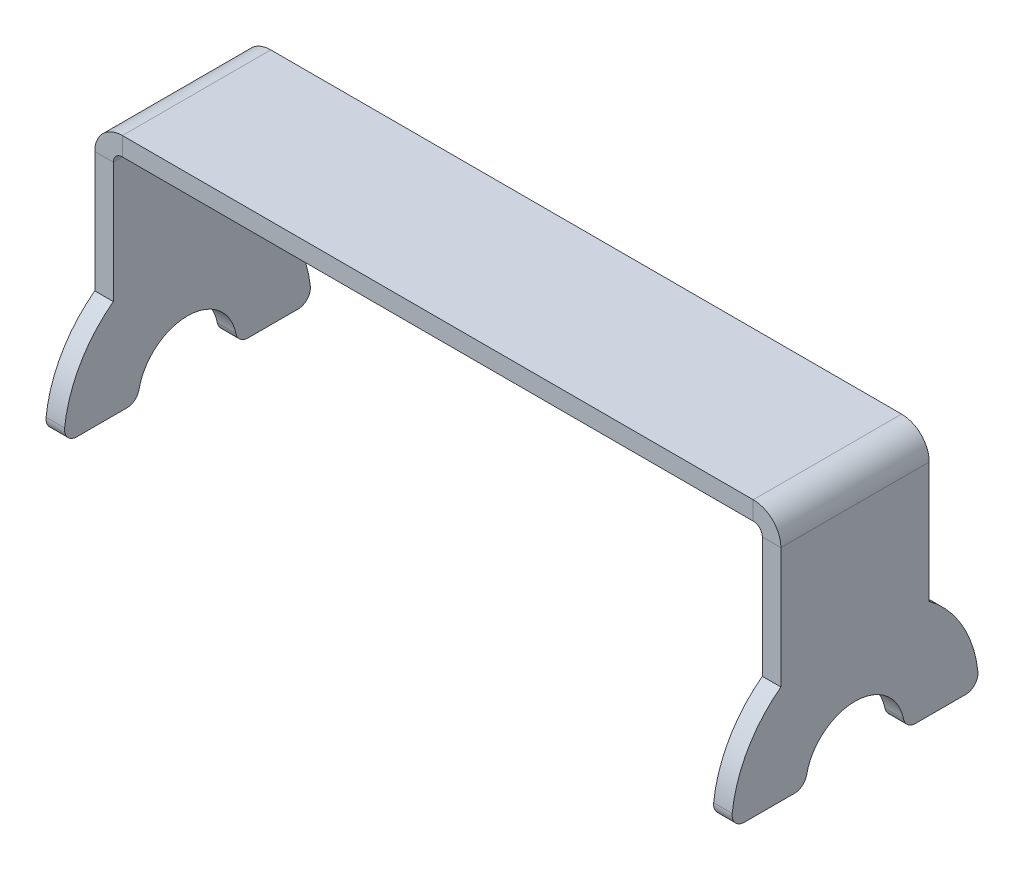
ISO-10303-21;
HEADER;
FILE_DESCRIPTION(('STEP AP214'),'2;1');
FILE_NAME('part.step','',(''),(''),'','','');
FILE_SCHEMA(('AUTOMOTIVE_DESIGN { 1 0 10303 214 1 1 1 1 }'));
ENDSEC;
DATA;
#1=APPLICATION_CONTEXT('core data for automotive mechanical design processes');
#2=APPLICATION_PROTOCOL_DEFINITION('international standard','automotive_design',2000,#1);
#3=PRODUCT_CONTEXT('',#1,'mechanical');
#4=PRODUCT('Part','Part','',(#3));
#5=PRODUCT_RELATED_PRODUCT_CATEGORY('part','',(#4));
#6=PRODUCT_DEFINITION_FORMATION('','',#4);
#7=PRODUCT_DEFINITION_CONTEXT('part definition',#1,'design');
#8=PRODUCT_DEFINITION('design','',#6,#7);
#9=PRODUCT_DEFINITION_SHAPE('','',#8);
#10=(LENGTH_UNIT() NAMED_UNIT(*) SI_UNIT(.MILLI.,.METRE.));
#11=(NAMED_UNIT(*) PLANE_ANGLE_UNIT() SI_UNIT($,.RADIAN.));
#12=(NAMED_UNIT(*) SI_UNIT($,.STERADIAN.) SOLID_ANGLE_UNIT());
#13=UNCERTAINTY_MEASURE_WITH_UNIT(LENGTH_MEASURE(1.E-05),#10,'distance_accuracy_value','');
#14=(GEOMETRIC_REPRESENTATION_CONTEXT(3) GLOBAL_UNCERTAINTY_ASSIGNED_CONTEXT((#13)) GLOBAL_UNIT_ASSIGNED_CONTEXT((#10,
#11,#12)) REPRESENTATION_CONTEXT('',''));
#15=CARTESIAN_POINT('',(0.,0.,0.));
#16=DIRECTION('',(0.,0.,1.));
#17=DIRECTION('',(1.,0.,0.));
#18=AXIS2_PLACEMENT_3D('',#15,#16,#17);
#19=CARTESIAN_POINT('',(-27.7500000000001,-20.,6.));
#20=DIRECTION('',(0.,1.,0.));
#21=DIRECTION('',(-1.,0.,0.));
#22=AXIS2_PLACEMENT_3D('',#19,#20,#21);
#23=PLANE('',#22);
#24=DIRECTION('',(0.,0.,-1.));
#25=VECTOR('',#24,1.);
#26=CARTESIAN_POINT('',(-26.2500000000001,-20.,6.));
#27=LINE('',#26,#25);
#28=CARTESIAN_POINT('',(-26.2500000000001,-20.,-8.94427190999916));
#29=VERTEX_POINT('',#28);
#30=CARTESIAN_POINT('',(-26.2500000000001,-20.,-4.89897948556635));
#31=VERTEX_POINT('',#30);
#32=EDGE_CURVE('E353',#29,#31,#27,.F.);
#33=ORIENTED_EDGE('',*,*,#32,.T.);
#34=DIRECTION('',(-1.,0.,0.));
#35=VECTOR('',#34,1.);
#36=CARTESIAN_POINT('',(-27.7500000000001,-20.,-4.89897948556635));
#37=LINE('',#36,#35);
#38=CARTESIAN_POINT('',(-27.7500000000001,-20.,-4.89897948556635));
#39=VERTEX_POINT('',#38);
#40=EDGE_CURVE('E88',#31,#39,#37,.T.);
#41=ORIENTED_EDGE('',*,*,#40,.T.);
#42=DIRECTION('',(0.,0.,1.));
#43=VECTOR('',#42,1.);
#44=CARTESIAN_POINT('',(-27.7500000000001,-20.,0.));
#45=LINE('',#44,#43);
#46=CARTESIAN_POINT('',(-27.7500000000001,-20.,-8.94427190999916));
#47=VERTEX_POINT('',#46);
#48=EDGE_CURVE('E344',#47,#39,#45,.T.);
#49=ORIENTED_EDGE('',*,*,#48,.F.);
#50=DIRECTION('',(1.,0.,0.));
#51=VECTOR('',#50,1.);
#52=CARTESIAN_POINT('',(-26.25,-20.,-8.94427190999916));
#53=LINE('',#52,#51);
#54=EDGE_CURVE('E460',#47,#29,#53,.T.);
#55=ORIENTED_EDGE('',*,*,#54,.T.);
#56=EDGE_LOOP('',(#33,#41,#49,#55));
#57=FACE_BOUND('',#56,.T.);
#58=ADVANCED_FACE('F80',(#57),#23,.F.);
#59=CARTESIAN_POINT('',(27.7500000000001,-20.,-6.));
#60=DIRECTION('',(0.,1.,0.));
#61=DIRECTION('',(-1.,0.,0.));
#62=AXIS2_PLACEMENT_3D('',#59,#60,#61);
#63=PLANE('',#62);
#64=DIRECTION('',(0.,0.,-1.));
#65=VECTOR('',#64,1.);
#66=CARTESIAN_POINT('',(27.7500000000001,-20.,0.));
#67=LINE('',#66,#65);
#68=CARTESIAN_POINT('',(27.7500000000001,-20.,-4.8989794855663));
#69=VERTEX_POINT('',#68);
#70=CARTESIAN_POINT('',(27.7500000000001,-20.,-8.9442719099993));
#71=VERTEX_POINT('',#70);
#72=EDGE_CURVE('E292',#69,#71,#67,.T.);
#73=ORIENTED_EDGE('',*,*,#72,.F.);
#74=DIRECTION('',(-1.,0.,0.));
#75=VECTOR('',#74,1.);
#76=CARTESIAN_POINT('',(27.7500000000001,-20.,-4.8989794855663));
#77=LINE('',#76,#75);
#78=CARTESIAN_POINT('',(26.2500000000001,-20.,-4.8989794855663));
#79=VERTEX_POINT('',#78);
#80=EDGE_CURVE('E429',#69,#79,#77,.T.);
#81=ORIENTED_EDGE('',*,*,#80,.T.);
#82=DIRECTION('',(0.,0.,1.));
#83=VECTOR('',#82,1.);
#84=CARTESIAN_POINT('',(26.2500000000001,-20.,-6.));
#85=LINE('',#84,#83);
#86=CARTESIAN_POINT('',(26.2500000000001,-20.,-8.9442719099993));
#87=VERTEX_POINT('',#86);
#88=EDGE_CURVE('E302',#79,#87,#85,.F.);
#89=ORIENTED_EDGE('',*,*,#88,.T.);
#90=DIRECTION('',(-1.,0.,0.));
#91=VECTOR('',#90,1.);
#92=CARTESIAN_POINT('',(27.7500000000001,-20.,-8.9442719099993));
#93=LINE('',#92,#91);
#94=EDGE_CURVE('E426',#87,#71,#93,.F.);
#95=ORIENTED_EDGE('',*,*,#94,.T.);
#96=EDGE_LOOP('',(#73,#81,#89,#95));
#97=FACE_BOUND('',#96,.T.);
#98=ADVANCED_FACE('F593',(#97),#63,.F.);
#99=CARTESIAN_POINT('',(0.,-1.5,0.));
#100=DIRECTION('',(0.,-1.,0.));
#101=DIRECTION('',(0.,0.,-1.));
#102=AXIS2_PLACEMENT_3D('',#99,#100,#101);
#103=PLANE('',#102);
#104=DIRECTION('',(-1.,0.,0.));
#105=VECTOR('',#104,1.);
#106=CARTESIAN_POINT('',(-27.75,-1.5,-6.));
#107=LINE('',#106,#105);
#108=CARTESIAN_POINT('',(25.5134,-1.5,-6.));
#109=VERTEX_POINT('',#108);
#110=CARTESIAN_POINT('',(-25.5134,-1.5,-6.));
#111=VERTEX_POINT('',#110);
#112=EDGE_CURVE('E391',#109,#111,#107,.T.);
#113=ORIENTED_EDGE('',*,*,#112,.F.);
#114=DIRECTION('',(0.,0.,1.));
#115=VECTOR('',#114,1.);
#116=CARTESIAN_POINT('',(25.5134,-1.5,6.));
#117=LINE('',#116,#115);
#118=CARTESIAN_POINT('',(25.5134,-1.5,6.));
#119=VERTEX_POINT('',#118);
#120=EDGE_CURVE('E328',#119,#109,#117,.F.);
#121=ORIENTED_EDGE('',*,*,#120,.F.);
#122=DIRECTION('',(1.,0.,0.));
#123=VECTOR('',#122,1.);
#124=CARTESIAN_POINT('',(-27.75,-1.5,6.));
#125=LINE('',#124,#123);
#126=CARTESIAN_POINT('',(-25.5134,-1.5,6.));
#127=VERTEX_POINT('',#126);
#128=EDGE_CURVE('E393',#127,#119,#125,.T.);
#129=ORIENTED_EDGE('',*,*,#128,.F.);
#130=DIRECTION('',(0.,0.,-1.));
#131=VECTOR('',#130,1.);
#132=CARTESIAN_POINT('',(-25.5134,-1.5,-6.));
#133=LINE('',#132,#131);
#134=EDGE_CURVE('E381',#111,#127,#133,.F.);
#135=ORIENTED_EDGE('',*,*,#134,.F.);
#136=EDGE_LOOP('',(#113,#121,#129,#135));
#137=FACE_BOUND('',#136,.T.);
#138=ADVANCED_FACE('F557',(#137),#103,.T.);
#139=CARTESIAN_POINT('',(0.,0.,0.));
#140=DIRECTION('',(0.,-1.,0.));
#141=DIRECTION('',(0.,0.,-1.));
#142=AXIS2_PLACEMENT_3D('',#139,#140,#141);
#143=PLANE('',#142);
#144=DIRECTION('',(0.,0.,1.));
#145=VECTOR('',#144,1.);
#146=CARTESIAN_POINT('',(25.5134,0.,6.));
#147=LINE('',#146,#145);
#148=CARTESIAN_POINT('',(25.5134,0.,6.));
#149=VERTEX_POINT('',#148);
#150=CARTESIAN_POINT('',(25.5134,0.,-6.));
#151=VERTEX_POINT('',#150);
#152=EDGE_CURVE('E316',#149,#151,#147,.F.);
#153=ORIENTED_EDGE('',*,*,#152,.T.);
#154=DIRECTION('',(-1.,0.,0.));
#155=VECTOR('',#154,1.);
#156=CARTESIAN_POINT('',(-27.75,0.,-6.));
#157=LINE('',#156,#155);
#158=CARTESIAN_POINT('',(-25.5134,0.,-6.));
#159=VERTEX_POINT('',#158);
#160=EDGE_CURVE('E389',#151,#159,#157,.T.);
#161=ORIENTED_EDGE('',*,*,#160,.T.);
#162=DIRECTION('',(0.,0.,-1.));
#163=VECTOR('',#162,1.);
#164=CARTESIAN_POINT('',(-25.5134,0.,-6.));
#165=LINE('',#164,#163);
#166=CARTESIAN_POINT('',(-25.5134,0.,6.));
#167=VERTEX_POINT('',#166);
#168=EDGE_CURVE('E369',#159,#167,#165,.F.);
#169=ORIENTED_EDGE('',*,*,#168,.T.);
#170=DIRECTION('',(1.,0.,0.));
#171=VECTOR('',#170,1.);
#172=CARTESIAN_POINT('',(-27.75,0.,6.));
#173=LINE('',#172,#171);
#174=EDGE_CURVE('E394',#167,#149,#173,.T.);
#175=ORIENTED_EDGE('',*,*,#174,.T.);
#176=EDGE_LOOP('',(#153,#161,#169,#175));
#177=FACE_BOUND('',#176,.T.);
#178=ADVANCED_FACE('F580',(#177),#143,.F.);
#179=CARTESIAN_POINT('',(-27.75,-1.5,6.));
#180=DIRECTION('',(0.,0.,1.));
#181=DIRECTION('',(1.,0.,0.));
#182=AXIS2_PLACEMENT_3D('',#179,#180,#181);
#183=PLANE('',#182);
#184=ORIENTED_EDGE('',*,*,#128,.T.);
#185=DIRECTION('',(0.,1.,0.));
#186=VECTOR('',#185,1.);
#187=CARTESIAN_POINT('',(25.5134,-1.5,6.));
#188=LINE('',#187,#186);
#189=EDGE_CURVE('E322',#119,#149,#188,.T.);
#190=ORIENTED_EDGE('',*,*,#189,.T.);
#191=ORIENTED_EDGE('',*,*,#174,.F.);
#192=DIRECTION('',(0.,1.,0.));
#193=VECTOR('',#192,1.);
#194=CARTESIAN_POINT('',(-25.5134,-1.5,6.));
#195=LINE('',#194,#193);
#196=EDGE_CURVE('E386',#127,#167,#195,.T.);
#197=ORIENTED_EDGE('',*,*,#196,.F.);
#198=EDGE_LOOP('',(#184,#190,#191,#197));
#199=FACE_BOUND('',#198,.T.);
#200=ADVANCED_FACE('F552',(#199),#183,.T.);
#201=CARTESIAN_POINT('',(-27.75,-1.5,-6.));
#202=DIRECTION('',(0.,0.,-1.));
#203=DIRECTION('',(-1.,0.,0.));
#204=AXIS2_PLACEMENT_3D('',#201,#202,#203);
#205=PLANE('',#204);
#206=DIRECTION('',(0.,1.,0.));
#207=VECTOR('',#206,1.);
#208=CARTESIAN_POINT('',(25.5134,-1.5,-6.));
#209=LINE('',#208,#207);
#210=EDGE_CURVE('E335',#109,#151,#209,.T.);
#211=ORIENTED_EDGE('',*,*,#210,.F.);
#212=ORIENTED_EDGE('',*,*,#112,.T.);
#213=DIRECTION('',(0.,1.,0.));
#214=VECTOR('',#213,1.);
#215=CARTESIAN_POINT('',(-25.5134,-1.5,-6.));
#216=LINE('',#215,#214);
#217=EDGE_CURVE('E375',#111,#159,#216,.T.);
#218=ORIENTED_EDGE('',*,*,#217,.T.);
#219=ORIENTED_EDGE('',*,*,#160,.F.);
#220=EDGE_LOOP('',(#211,#212,#218,#219));
#221=FACE_BOUND('',#220,.T.);
#222=ADVANCED_FACE('F582',(#221),#205,.T.);
#223=CARTESIAN_POINT('',(-25.5134,-2.2366,6.));
#224=DIRECTION('',(0.,0.,1.));
#225=DIRECTION('',(1.,0.,0.));
#226=AXIS2_PLACEMENT_3D('',#223,#224,#225);
#227=PLANE('',#226);
#228=DIRECTION('',(1.,0.,0.));
#229=VECTOR('',#228,1.);
#230=CARTESIAN_POINT('',(-27.75,-2.23659999999999,6.));
#231=LINE('',#230,#229);
#232=CARTESIAN_POINT('',(-26.25,-2.2366,6.));
#233=VERTEX_POINT('',#232);
#234=CARTESIAN_POINT('',(-27.75,-2.23659999999999,6.));
#235=VERTEX_POINT('',#234);
#236=EDGE_CURVE('E338',#233,#235,#231,.F.);
#237=ORIENTED_EDGE('',*,*,#236,.F.);
#238=CARTESIAN_POINT('',(-25.5134,-2.2366,6.));
#239=DIRECTION('',(0.,0.,-1.));
#240=DIRECTION('',(-1.,0.,0.));
#241=AXIS2_PLACEMENT_3D('',#238,#239,#240);
#242=CIRCLE('',#241,0.7366);
#243=EDGE_CURVE('E378',#127,#233,#242,.F.);
#244=ORIENTED_EDGE('',*,*,#243,.F.);
#245=ORIENTED_EDGE('',*,*,#196,.T.);
#246=CARTESIAN_POINT('',(-25.5134,-2.2366,6.));
#247=DIRECTION('',(0.,0.,-1.));
#248=DIRECTION('',(-1.,0.,0.));
#249=AXIS2_PLACEMENT_3D('',#246,#247,#248);
#250=CIRCLE('',#249,2.2366);
#251=EDGE_CURVE('E371',#167,#235,#250,.F.);
#252=ORIENTED_EDGE('',*,*,#251,.T.);
#253=EDGE_LOOP('',(#237,#244,#245,#252));
#254=FACE_BOUND('',#253,.T.);
#255=ADVANCED_FACE('F548',(#254),#227,.T.);
#256=CARTESIAN_POINT('',(-25.5134,-2.2366,-6.));
#257=DIRECTION('',(0.,0.,1.));
#258=DIRECTION('',(1.,0.,0.));
#259=AXIS2_PLACEMENT_3D('',#256,#257,#258);
#260=PLANE('',#259);
#261=CARTESIAN_POINT('',(-25.5134,-2.2366,-6.));
#262=DIRECTION('',(0.,0.,-1.));
#263=DIRECTION('',(-1.,0.,0.));
#264=AXIS2_PLACEMENT_3D('',#261,#262,#263);
#265=CIRCLE('',#264,0.7366);
#266=CARTESIAN_POINT('',(-26.25,-2.2366,-6.));
#267=VERTEX_POINT('',#266);
#268=EDGE_CURVE('E343',#267,#111,#265,.T.);
#269=ORIENTED_EDGE('',*,*,#268,.F.);
#270=DIRECTION('',(1.,0.,0.));
#271=VECTOR('',#270,1.);
#272=CARTESIAN_POINT('',(-26.25,-2.2366,-6.));
#273=LINE('',#272,#271);
#274=CARTESIAN_POINT('',(-27.75,-2.23659999999999,-6.));
#275=VERTEX_POINT('',#274);
#276=EDGE_CURVE('E362',#267,#275,#273,.F.);
#277=ORIENTED_EDGE('',*,*,#276,.T.);
#278=CARTESIAN_POINT('',(-25.5134,-2.2366,-6.));
#279=DIRECTION('',(0.,0.,-1.));
#280=DIRECTION('',(-1.,0.,0.));
#281=AXIS2_PLACEMENT_3D('',#278,#279,#280);
#282=CIRCLE('',#281,2.2366);
#283=EDGE_CURVE('E372',#275,#159,#282,.T.);
#284=ORIENTED_EDGE('',*,*,#283,.T.);
#285=ORIENTED_EDGE('',*,*,#217,.F.);
#286=EDGE_LOOP('',(#269,#277,#284,#285));
#287=FACE_BOUND('',#286,.T.);
#288=ADVANCED_FACE('F538',(#287),#260,.F.);
#289=CARTESIAN_POINT('',(-25.5134,-2.2366,-6.));
#290=DIRECTION('',(0.,0.,-1.));
#291=DIRECTION('',(-1.,0.,0.));
#292=AXIS2_PLACEMENT_3D('',#289,#290,#291);
#293=CYLINDRICAL_SURFACE('',#292,2.2366);
#294=ORIENTED_EDGE('',*,*,#168,.F.);
#295=ORIENTED_EDGE('',*,*,#283,.F.);
#296=DIRECTION('',(0.,0.,-1.));
#297=VECTOR('',#296,1.);
#298=CARTESIAN_POINT('',(-27.75,-2.23659999999999,6.));
#299=LINE('',#298,#297);
#300=EDGE_CURVE('E359',#275,#235,#299,.F.);
#301=ORIENTED_EDGE('',*,*,#300,.T.);
#302=ORIENTED_EDGE('',*,*,#251,.F.);
#303=EDGE_LOOP('',(#294,#295,#301,#302));
#304=FACE_BOUND('',#303,.T.);
#305=ADVANCED_FACE('F546',(#304),#293,.T.);
#306=CARTESIAN_POINT('',(-25.5134,-2.2366,-6.));
#307=DIRECTION('',(0.,0.,-1.));
#308=DIRECTION('',(-1.,0.,0.));
#309=AXIS2_PLACEMENT_3D('',#306,#307,#308);
#310=CYLINDRICAL_SURFACE('',#309,0.7366);
#311=ORIENTED_EDGE('',*,*,#134,.T.);
#312=ORIENTED_EDGE('',*,*,#243,.T.);
#313=DIRECTION('',(0.,0.,-1.));
#314=VECTOR('',#313,1.);
#315=CARTESIAN_POINT('',(-26.25,-2.2366,6.));
#316=LINE('',#315,#314);
#317=EDGE_CURVE('E365',#233,#267,#316,.T.);
#318=ORIENTED_EDGE('',*,*,#317,.T.);
#319=ORIENTED_EDGE('',*,*,#268,.T.);
#320=EDGE_LOOP('',(#311,#312,#318,#319));
#321=FACE_BOUND('',#320,.T.);
#322=ADVANCED_FACE('F533',(#321),#310,.F.);
#323=CARTESIAN_POINT('',(-27.7500000000001,-20.,-6.));
#324=DIRECTION('',(0.,0.,1.));
#325=DIRECTION('',(0.,-1.,0.));
#326=AXIS2_PLACEMENT_3D('',#323,#324,#325);
#327=PLANE('',#326);
#328=DIRECTION('',(0.,1.,0.));
#329=VECTOR('',#328,1.);
#330=CARTESIAN_POINT('',(-26.2500000000001,-20.,-6.));
#331=LINE('',#330,#329);
#332=CARTESIAN_POINT('',(-26.25,-12.,-6.));
#333=VERTEX_POINT('',#332);
#334=EDGE_CURVE('E356',#267,#333,#331,.F.);
#335=ORIENTED_EDGE('',*,*,#334,.T.);
#336=DIRECTION('',(-1.,0.,0.));
#337=VECTOR('',#336,1.);
#338=CARTESIAN_POINT('',(-17.3057280900009,-12.,-6.));
#339=LINE('',#338,#337);
#340=CARTESIAN_POINT('',(-27.75,-12.,-6.));
#341=VERTEX_POINT('',#340);
#342=EDGE_CURVE('E315',#333,#341,#339,.T.);
#343=ORIENTED_EDGE('',*,*,#342,.T.);
#344=DIRECTION('',(0.,-1.,0.));
#345=VECTOR('',#344,1.);
#346=CARTESIAN_POINT('',(-27.75,1.03553847119707E-13,-6.));
#347=LINE('',#346,#345);
#348=EDGE_CURVE('E348',#275,#341,#347,.T.);
#349=ORIENTED_EDGE('',*,*,#348,.F.);
#350=ORIENTED_EDGE('',*,*,#276,.F.);
#351=EDGE_LOOP('',(#335,#343,#349,#350));
#352=FACE_BOUND('',#351,.T.);
#353=ADVANCED_FACE('F542',(#352),#327,.F.);
#354=CARTESIAN_POINT('',(-27.75,-1.49999999999999,6.));
#355=DIRECTION('',(0.,0.,-1.));
#356=DIRECTION('',(0.,1.,0.));
#357=AXIS2_PLACEMENT_3D('',#354,#355,#356);
#358=PLANE('',#357);
#359=DIRECTION('',(0.,1.,0.));
#360=VECTOR('',#359,1.);
#361=CARTESIAN_POINT('',(-27.75,1.03553847119707E-13,6.));
#362=LINE('',#361,#360);
#363=CARTESIAN_POINT('',(-27.75,-12.,6.));
#364=VERTEX_POINT('',#363);
#365=EDGE_CURVE('E341',#364,#235,#362,.T.);
#366=ORIENTED_EDGE('',*,*,#365,.F.);
#367=DIRECTION('',(-1.,0.,0.));
#368=VECTOR('',#367,1.);
#369=CARTESIAN_POINT('',(-17.3057280900009,-12.,6.));
#370=LINE('',#369,#368);
#371=CARTESIAN_POINT('',(-26.25,-12.,6.));
#372=VERTEX_POINT('',#371);
#373=EDGE_CURVE('E484',#372,#364,#370,.T.);
#374=ORIENTED_EDGE('',*,*,#373,.F.);
#375=DIRECTION('',(0.,-1.,0.));
#376=VECTOR('',#375,1.);
#377=CARTESIAN_POINT('',(-26.25,-1.5,6.));
#378=LINE('',#377,#376);
#379=EDGE_CURVE('E351',#372,#233,#378,.F.);
#380=ORIENTED_EDGE('',*,*,#379,.T.);
#381=ORIENTED_EDGE('',*,*,#236,.T.);
#382=EDGE_LOOP('',(#366,#374,#380,#381));
#383=FACE_BOUND('',#382,.T.);
#384=ADVANCED_FACE('F526',(#383),#358,.F.);
#385=CARTESIAN_POINT('',(-27.75,1.04116460138943E-13,0.));
#386=DIRECTION('',(1.,0.,0.));
#387=DIRECTION('',(0.,1.,0.));
#388=AXIS2_PLACEMENT_3D('',#385,#386,#387);
#389=PLANE('',#388);
#390=CARTESIAN_POINT('',(-27.7500000000001,-20.,4.89897948556635));
#391=VERTEX_POINT('',#390);
#392=CARTESIAN_POINT('',(-27.7500000000001,-20.,8.94427190999916));
#393=VERTEX_POINT('',#392);
#394=EDGE_CURVE('E347',#391,#393,#45,.T.);
#395=ORIENTED_EDGE('',*,*,#394,.T.);
#396=CARTESIAN_POINT('',(-27.7500000000001,-19.,8.94427190999916));
#397=DIRECTION('',(1.,0.,0.));
#398=DIRECTION('',(0.,1.,0.));
#399=AXIS2_PLACEMENT_3D('',#396,#397,#398);
#400=CIRCLE('',#399,1.);
#401=CARTESIAN_POINT('',(-27.7500000000001,-18.8888888888889,9.93807989999907));
#402=VERTEX_POINT('',#401);
#403=EDGE_CURVE('E446',#393,#402,#400,.F.);
#404=ORIENTED_EDGE('',*,*,#403,.T.);
#405=CARTESIAN_POINT('',(-27.7500000000001,-20.,0.));
#406=DIRECTION('',(-1.,0.,0.));
#407=DIRECTION('',(0.,-1.,0.));
#408=AXIS2_PLACEMENT_3D('',#405,#406,#407);
#409=CIRCLE('',#408,10.);
#410=EDGE_CURVE('E513',#402,#364,#409,.T.);
#411=ORIENTED_EDGE('',*,*,#410,.T.);
#412=ORIENTED_EDGE('',*,*,#365,.T.);
#413=ORIENTED_EDGE('',*,*,#300,.F.);
#414=ORIENTED_EDGE('',*,*,#348,.T.);
#415=CARTESIAN_POINT('',(-27.7500000000001,-20.,0.));
#416=DIRECTION('',(-1.,0.,0.));
#417=DIRECTION('',(0.,-1.,0.));
#418=AXIS2_PLACEMENT_3D('',#415,#416,#417);
#419=CIRCLE('',#418,10.);
#420=CARTESIAN_POINT('',(-27.7500000000001,-18.8888888888889,-9.93807989999907));
#421=VERTEX_POINT('',#420);
#422=EDGE_CURVE('E473',#341,#421,#419,.T.);
#423=ORIENTED_EDGE('',*,*,#422,.T.);
#424=CARTESIAN_POINT('',(-27.7500000000001,-19.,-8.94427190999916));
#425=DIRECTION('',(1.,0.,0.));
#426=DIRECTION('',(0.,1.,0.));
#427=AXIS2_PLACEMENT_3D('',#424,#425,#426);
#428=CIRCLE('',#427,1.);
#429=EDGE_CURVE('E440',#421,#47,#428,.F.);
#430=ORIENTED_EDGE('',*,*,#429,.T.);
#431=ORIENTED_EDGE('',*,*,#48,.T.);
#432=CARTESIAN_POINT('',(-27.7500000000001,-19.,-4.89897948556635));
#433=DIRECTION('',(1.,0.,0.));
#434=DIRECTION('',(0.,1.,0.));
#435=AXIS2_PLACEMENT_3D('',#432,#433,#434);
#436=CIRCLE('',#435,1.);
#437=CARTESIAN_POINT('',(-27.7500000000001,-19.2,-3.91918358845308));
#438=VERTEX_POINT('',#437);
#439=EDGE_CURVE('E442',#39,#438,#436,.F.);
#440=ORIENTED_EDGE('',*,*,#439,.T.);
#441=CARTESIAN_POINT('',(-27.7500000000001,-20.,0.));
#442=DIRECTION('',(-1.,0.,0.));
#443=DIRECTION('',(0.,-1.,0.));
#444=AXIS2_PLACEMENT_3D('',#441,#442,#443);
#445=CIRCLE('',#444,4.);
#446=CARTESIAN_POINT('',(-27.7500000000001,-19.2,3.91918358845308));
#447=VERTEX_POINT('',#446);
#448=EDGE_CURVE('E632',#447,#438,#445,.T.);
#449=ORIENTED_EDGE('',*,*,#448,.F.);
#450=CARTESIAN_POINT('',(-27.7500000000001,-19.,4.89897948556635));
#451=DIRECTION('',(1.,0.,0.));
#452=DIRECTION('',(0.,1.,0.));
#453=AXIS2_PLACEMENT_3D('',#450,#451,#452);
#454=CIRCLE('',#453,1.);
#455=EDGE_CURVE('E444',#447,#391,#454,.F.);
#456=ORIENTED_EDGE('',*,*,#455,.T.);
#457=EDGE_LOOP('',(#395,#404,#411,#412,#413,#414,#423,#430,#431,#440,#449,#456));
#458=FACE_BOUND('',#457,.T.);
#459=ADVANCED_FACE('F469',(#458),#389,.F.);
#460=CARTESIAN_POINT('',(-26.25,0.,0.));
#461=DIRECTION('',(1.,0.,0.));
#462=DIRECTION('',(0.,1.,0.));
#463=AXIS2_PLACEMENT_3D('',#460,#461,#462);
#464=PLANE('',#463);
#465=CARTESIAN_POINT('',(-26.2500000000001,-20.,0.));
#466=DIRECTION('',(1.,0.,0.));
#467=DIRECTION('',(0.,1.,0.));
#468=AXIS2_PLACEMENT_3D('',#465,#466,#467);
#469=CIRCLE('',#468,10.);
#470=CARTESIAN_POINT('',(-26.2500000000001,-18.8888888888889,9.93807989999907));
#471=VERTEX_POINT('',#470);
#472=EDGE_CURVE('E515',#471,#372,#469,.F.);
#473=ORIENTED_EDGE('',*,*,#472,.F.);
#474=CARTESIAN_POINT('',(-26.2500000000001,-19.,8.94427190999916));
#475=DIRECTION('',(1.,0.,0.));
#476=DIRECTION('',(0.,1.,0.));
#477=AXIS2_PLACEMENT_3D('',#474,#475,#476);
#478=CIRCLE('',#477,1.);
#479=CARTESIAN_POINT('',(-26.2500000000001,-20.,8.94427190999916));
#480=VERTEX_POINT('',#479);
#481=EDGE_CURVE('E454',#471,#480,#478,.T.);
#482=ORIENTED_EDGE('',*,*,#481,.T.);
#483=CARTESIAN_POINT('',(-26.2500000000001,-20.,4.89897948556635));
#484=VERTEX_POINT('',#483);
#485=EDGE_CURVE('E355',#484,#480,#27,.F.);
#486=ORIENTED_EDGE('',*,*,#485,.F.);
#487=CARTESIAN_POINT('',(-26.2500000000001,-19.,4.89897948556635));
#488=DIRECTION('',(1.,0.,0.));
#489=DIRECTION('',(0.,1.,0.));
#490=AXIS2_PLACEMENT_3D('',#487,#488,#489);
#491=CIRCLE('',#490,1.);
#492=CARTESIAN_POINT('',(-26.2500000000001,-19.2,3.91918358845308));
#493=VERTEX_POINT('',#492);
#494=EDGE_CURVE('E452',#484,#493,#491,.T.);
#495=ORIENTED_EDGE('',*,*,#494,.T.);
#496=CARTESIAN_POINT('',(-26.2500000000001,-20.,0.));
#497=DIRECTION('',(1.,0.,0.));
#498=DIRECTION('',(0.,1.,0.));
#499=AXIS2_PLACEMENT_3D('',#496,#497,#498);
#500=CIRCLE('',#499,4.);
#501=CARTESIAN_POINT('',(-26.2500000000001,-19.2,-3.91918358845308));
#502=VERTEX_POINT('',#501);
#503=EDGE_CURVE('E277',#502,#493,#500,.T.);
#504=ORIENTED_EDGE('',*,*,#503,.F.);
#505=CARTESIAN_POINT('',(-26.2500000000001,-19.,-4.89897948556635));
#506=DIRECTION('',(1.,0.,0.));
#507=DIRECTION('',(0.,1.,0.));
#508=AXIS2_PLACEMENT_3D('',#505,#506,#507);
#509=CIRCLE('',#508,1.);
#510=EDGE_CURVE('E101',#502,#31,#509,.T.);
#511=ORIENTED_EDGE('',*,*,#510,.T.);
#512=ORIENTED_EDGE('',*,*,#32,.F.);
#513=CARTESIAN_POINT('',(-26.2500000000001,-19.,-8.94427190999916));
#514=DIRECTION('',(1.,0.,0.));
#515=DIRECTION('',(0.,1.,0.));
#516=AXIS2_PLACEMENT_3D('',#513,#514,#515);
#517=CIRCLE('',#516,1.);
#518=CARTESIAN_POINT('',(-26.2500000000001,-18.8888888888889,-9.93807989999907));
#519=VERTEX_POINT('',#518);
#520=EDGE_CURVE('E95',#29,#519,#517,.T.);
#521=ORIENTED_EDGE('',*,*,#520,.T.);
#522=CARTESIAN_POINT('',(-26.2500000000001,-20.,0.));
#523=DIRECTION('',(1.,0.,0.));
#524=DIRECTION('',(0.,1.,0.));
#525=AXIS2_PLACEMENT_3D('',#522,#523,#524);
#526=CIRCLE('',#525,10.);
#527=EDGE_CURVE('E480',#333,#519,#526,.F.);
#528=ORIENTED_EDGE('',*,*,#527,.F.);
#529=ORIENTED_EDGE('',*,*,#334,.F.);
#530=ORIENTED_EDGE('',*,*,#317,.F.);
#531=ORIENTED_EDGE('',*,*,#379,.F.);
#532=EDGE_LOOP('',(#473,#482,#486,#495,#504,#511,#512,#521,#528,#529,#530,#531));
#533=FACE_BOUND('',#532,.T.);
#534=ADVANCED_FACE('F529',(#533),#464,.T.);
#535=ORIENTED_EDGE('',*,*,#485,.T.);
#536=DIRECTION('',(1.,0.,0.));
#537=VECTOR('',#536,1.);
#538=CARTESIAN_POINT('',(-27.7500000000001,-20.,8.94427190999916));
#539=LINE('',#538,#537);
#540=EDGE_CURVE('E437',#480,#393,#539,.F.);
#541=ORIENTED_EDGE('',*,*,#540,.T.);
#542=ORIENTED_EDGE('',*,*,#394,.F.);
#543=DIRECTION('',(-1.,0.,0.));
#544=VECTOR('',#543,1.);
#545=CARTESIAN_POINT('',(-27.7500000000001,-20.,4.89897948556635));
#546=LINE('',#545,#544);
#547=EDGE_CURVE('E434',#391,#484,#546,.F.);
#548=ORIENTED_EDGE('',*,*,#547,.T.);
#549=EDGE_LOOP('',(#535,#541,#542,#548));
#550=FACE_BOUND('',#549,.T.);
#551=ADVANCED_FACE('F595',(#550),#23,.F.);
#552=CARTESIAN_POINT('',(25.5134,-2.2366,-6.));
#553=DIRECTION('',(0.,0.,-1.));
#554=DIRECTION('',(-1.,0.,0.));
#555=AXIS2_PLACEMENT_3D('',#552,#553,#554);
#556=PLANE('',#555);
#557=DIRECTION('',(-1.,0.,0.));
#558=VECTOR('',#557,1.);
#559=CARTESIAN_POINT('',(27.75,-2.23659999999999,-6.));
#560=LINE('',#559,#558);
#561=CARTESIAN_POINT('',(26.25,-2.2366,-6.));
#562=VERTEX_POINT('',#561);
#563=CARTESIAN_POINT('',(27.75,-2.23659999999999,-6.));
#564=VERTEX_POINT('',#563);
#565=EDGE_CURVE('E312',#562,#564,#560,.F.);
#566=ORIENTED_EDGE('',*,*,#565,.F.);
#567=CARTESIAN_POINT('',(25.5134,-2.2366,-6.));
#568=DIRECTION('',(0.,0.,1.));
#569=DIRECTION('',(1.,0.,0.));
#570=AXIS2_PLACEMENT_3D('',#567,#568,#569);
#571=CIRCLE('',#570,0.7366);
#572=EDGE_CURVE('E325',#109,#562,#571,.F.);
#573=ORIENTED_EDGE('',*,*,#572,.F.);
#574=ORIENTED_EDGE('',*,*,#210,.T.);
#575=CARTESIAN_POINT('',(25.5134,-2.2366,-6.));
#576=DIRECTION('',(0.,0.,1.));
#577=DIRECTION('',(1.,0.,0.));
#578=AXIS2_PLACEMENT_3D('',#575,#576,#577);
#579=CIRCLE('',#578,2.2366);
#580=EDGE_CURVE('E318',#151,#564,#579,.F.);
#581=ORIENTED_EDGE('',*,*,#580,.T.);
#582=EDGE_LOOP('',(#566,#573,#574,#581));
#583=FACE_BOUND('',#582,.T.);
#584=ADVANCED_FACE('F565',(#583),#556,.T.);
#585=CARTESIAN_POINT('',(25.5134,-2.2366,6.));
#586=DIRECTION('',(0.,0.,-1.));
#587=DIRECTION('',(-1.,0.,0.));
#588=AXIS2_PLACEMENT_3D('',#585,#586,#587);
#589=PLANE('',#588);
#590=CARTESIAN_POINT('',(25.5134,-2.2366,6.));
#591=DIRECTION('',(0.,0.,1.));
#592=DIRECTION('',(1.,0.,0.));
#593=AXIS2_PLACEMENT_3D('',#590,#591,#592);
#594=CIRCLE('',#593,0.7366);
#595=CARTESIAN_POINT('',(26.25,-2.2366,6.));
#596=VERTEX_POINT('',#595);
#597=EDGE_CURVE('E331',#596,#119,#594,.T.);
#598=ORIENTED_EDGE('',*,*,#597,.F.);
#599=DIRECTION('',(-1.,0.,0.));
#600=VECTOR('',#599,1.);
#601=CARTESIAN_POINT('',(26.25,-2.2366,6.));
#602=LINE('',#601,#600);
#603=CARTESIAN_POINT('',(27.75,-2.23659999999999,6.));
#604=VERTEX_POINT('',#603);
#605=EDGE_CURVE('E307',#596,#604,#602,.F.);
#606=ORIENTED_EDGE('',*,*,#605,.T.);
#607=CARTESIAN_POINT('',(25.5134,-2.2366,6.));
#608=DIRECTION('',(0.,0.,1.));
#609=DIRECTION('',(1.,0.,0.));
#610=AXIS2_PLACEMENT_3D('',#607,#608,#609);
#611=CIRCLE('',#610,2.2366);
#612=EDGE_CURVE('E319',#604,#149,#611,.T.);
#613=ORIENTED_EDGE('',*,*,#612,.T.);
#614=ORIENTED_EDGE('',*,*,#189,.F.);
#615=EDGE_LOOP('',(#598,#606,#613,#614));
#616=FACE_BOUND('',#615,.T.);
#617=ADVANCED_FACE('F574',(#616),#589,.F.);
#618=CARTESIAN_POINT('',(25.5134,-2.2366,6.));
#619=DIRECTION('',(0.,0.,1.));
#620=DIRECTION('',(1.,0.,0.));
#621=AXIS2_PLACEMENT_3D('',#618,#619,#620);
#622=CYLINDRICAL_SURFACE('',#621,2.2366);
#623=ORIENTED_EDGE('',*,*,#152,.F.);
#624=ORIENTED_EDGE('',*,*,#612,.F.);
#625=DIRECTION('',(0.,0.,1.));
#626=VECTOR('',#625,1.);
#627=CARTESIAN_POINT('',(27.75,-2.23659999999999,-6.));
#628=LINE('',#627,#626);
#629=EDGE_CURVE('E291',#604,#564,#628,.F.);
#630=ORIENTED_EDGE('',*,*,#629,.T.);
#631=ORIENTED_EDGE('',*,*,#580,.F.);
#632=EDGE_LOOP('',(#623,#624,#630,#631));
#633=FACE_BOUND('',#632,.T.);
#634=ADVANCED_FACE('F577',(#633),#622,.T.);
#635=CARTESIAN_POINT('',(25.5134,-2.2366,6.));
#636=DIRECTION('',(0.,0.,1.));
#637=DIRECTION('',(1.,0.,0.));
#638=AXIS2_PLACEMENT_3D('',#635,#636,#637);
#639=CYLINDRICAL_SURFACE('',#638,0.7366);
#640=ORIENTED_EDGE('',*,*,#120,.T.);
#641=ORIENTED_EDGE('',*,*,#572,.T.);
#642=DIRECTION('',(0.,0.,1.));
#643=VECTOR('',#642,1.);
#644=CARTESIAN_POINT('',(26.25,-2.2366,-6.));
#645=LINE('',#644,#643);
#646=EDGE_CURVE('E310',#562,#596,#645,.T.);
#647=ORIENTED_EDGE('',*,*,#646,.T.);
#648=ORIENTED_EDGE('',*,*,#597,.T.);
#649=EDGE_LOOP('',(#640,#641,#647,#648));
#650=FACE_BOUND('',#649,.T.);
#651=ADVANCED_FACE('F560',(#650),#639,.F.);
#652=CARTESIAN_POINT('',(27.7500000000001,-20.,5.99999999999999));
#653=DIRECTION('',(0.,0.,-1.));
#654=DIRECTION('',(0.,1.,0.));
#655=AXIS2_PLACEMENT_3D('',#652,#653,#654);
#656=PLANE('',#655);
#657=DIRECTION('',(0.,1.,0.));
#658=VECTOR('',#657,1.);
#659=CARTESIAN_POINT('',(26.2500000000001,-20.,5.99999999999999));
#660=LINE('',#659,#658);
#661=CARTESIAN_POINT('',(26.25,-11.9999999999998,6.));
#662=VERTEX_POINT('',#661);
#663=EDGE_CURVE('E285',#596,#662,#660,.F.);
#664=ORIENTED_EDGE('',*,*,#663,.T.);
#665=DIRECTION('',(1.,0.,0.));
#666=VECTOR('',#665,1.);
#667=CARTESIAN_POINT('',(17.3057280900007,-11.9999999999999,6.));
#668=LINE('',#667,#666);
#669=CARTESIAN_POINT('',(27.75,-11.9999999999998,6.));
#670=VERTEX_POINT('',#669);
#671=EDGE_CURVE('E271',#662,#670,#668,.T.);
#672=ORIENTED_EDGE('',*,*,#671,.T.);
#673=DIRECTION('',(0.,-1.,0.));
#674=VECTOR('',#673,1.);
#675=CARTESIAN_POINT('',(27.75,1.02428621081235E-13,6.));
#676=LINE('',#675,#674);
#677=EDGE_CURVE('E283',#604,#670,#676,.T.);
#678=ORIENTED_EDGE('',*,*,#677,.F.);
#679=ORIENTED_EDGE('',*,*,#605,.F.);
#680=EDGE_LOOP('',(#664,#672,#678,#679));
#681=FACE_BOUND('',#680,.T.);
#682=ADVANCED_FACE('F281',(#681),#656,.F.);
#683=CARTESIAN_POINT('',(27.75,-1.49999999999999,-6.));
#684=DIRECTION('',(0.,0.,1.));
#685=DIRECTION('',(0.,-1.,0.));
#686=AXIS2_PLACEMENT_3D('',#683,#684,#685);
#687=PLANE('',#686);
#688=DIRECTION('',(0.,1.,0.));
#689=VECTOR('',#688,1.);
#690=CARTESIAN_POINT('',(27.75,1.04679073158178E-13,-6.));
#691=LINE('',#690,#689);
#692=CARTESIAN_POINT('',(27.75,-11.9999999999998,-6.));
#693=VERTEX_POINT('',#692);
#694=EDGE_CURVE('E334',#693,#564,#691,.T.);
#695=ORIENTED_EDGE('',*,*,#694,.F.);
#696=DIRECTION('',(1.,0.,0.));
#697=VECTOR('',#696,1.);
#698=CARTESIAN_POINT('',(17.3057280900007,-11.9999999999999,-6.));
#699=LINE('',#698,#697);
#700=CARTESIAN_POINT('',(26.25,-11.9999999999998,-6.));
#701=VERTEX_POINT('',#700);
#702=EDGE_CURVE('E510',#701,#693,#699,.T.);
#703=ORIENTED_EDGE('',*,*,#702,.F.);
#704=DIRECTION('',(0.,-1.,0.));
#705=VECTOR('',#704,1.);
#706=CARTESIAN_POINT('',(26.25,-1.5,-6.));
#707=LINE('',#706,#705);
#708=EDGE_CURVE('E293',#701,#562,#707,.F.);
#709=ORIENTED_EDGE('',*,*,#708,.T.);
#710=ORIENTED_EDGE('',*,*,#565,.T.);
#711=EDGE_LOOP('',(#695,#703,#709,#710));
#712=FACE_BOUND('',#711,.T.);
#713=ADVANCED_FACE('F568',(#712),#687,.F.);
#714=CARTESIAN_POINT('',(27.75,1.04116460138943E-13,0.));
#715=DIRECTION('',(-1.,0.,0.));
#716=DIRECTION('',(0.,-1.,0.));
#717=AXIS2_PLACEMENT_3D('',#714,#715,#716);
#718=PLANE('',#717);
#719=CARTESIAN_POINT('',(27.7500000000001,-20.,0.));
#720=DIRECTION('',(1.,0.,0.));
#721=DIRECTION('',(0.,1.,0.));
#722=AXIS2_PLACEMENT_3D('',#719,#720,#721);
#723=CIRCLE('',#722,10.0000000000001);
#724=CARTESIAN_POINT('',(27.7500000000001,-18.8888888888889,9.9380798999992));
#725=VERTEX_POINT('',#724);
#726=EDGE_CURVE('E267',#670,#725,#723,.T.);
#727=ORIENTED_EDGE('',*,*,#726,.T.);
#728=CARTESIAN_POINT('',(27.7500000000001,-19.,8.94427190999929));
#729=DIRECTION('',(-1.,0.,0.));
#730=DIRECTION('',(0.,-1.,0.));
#731=AXIS2_PLACEMENT_3D('',#728,#729,#730);
#732=CIRCLE('',#731,1.);
#733=CARTESIAN_POINT('',(27.7500000000001,-20.,8.94427190999929));
#734=VERTEX_POINT('',#733);
#735=EDGE_CURVE('E407',#725,#734,#732,.F.);
#736=ORIENTED_EDGE('',*,*,#735,.T.);
#737=CARTESIAN_POINT('',(27.7500000000001,-20.,4.8989794855663));
#738=VERTEX_POINT('',#737);
#739=EDGE_CURVE('E296',#734,#738,#67,.T.);
#740=ORIENTED_EDGE('',*,*,#739,.T.);
#741=CARTESIAN_POINT('',(27.7500000000001,-18.9999999999999,4.8989794855663));
#742=DIRECTION('',(-1.,0.,0.));
#743=DIRECTION('',(0.,-1.,0.));
#744=AXIS2_PLACEMENT_3D('',#741,#742,#743);
#745=CIRCLE('',#744,1.);
#746=CARTESIAN_POINT('',(27.7500000000001,-19.2,3.91918358845304));
#747=VERTEX_POINT('',#746);
#748=EDGE_CURVE('E405',#738,#747,#745,.F.);
#749=ORIENTED_EDGE('',*,*,#748,.T.);
#750=CARTESIAN_POINT('',(27.7500000000001,-20.0000000000002,0.));
#751=DIRECTION('',(-1.,0.,0.));
#752=DIRECTION('',(0.,-1.,0.));
#753=AXIS2_PLACEMENT_3D('',#750,#751,#752);
#754=CIRCLE('',#753,4.);
#755=CARTESIAN_POINT('',(27.7500000000001,-19.2,-3.91918358845304));
#756=VERTEX_POINT('',#755);
#757=EDGE_CURVE('E628',#756,#747,#754,.F.);
#758=ORIENTED_EDGE('',*,*,#757,.F.);
#759=CARTESIAN_POINT('',(27.7500000000001,-18.9999999999999,-4.8989794855663));
#760=DIRECTION('',(-1.,0.,0.));
#761=DIRECTION('',(0.,-1.,0.));
#762=AXIS2_PLACEMENT_3D('',#759,#760,#761);
#763=CIRCLE('',#762,1.);
#764=EDGE_CURVE('E403',#756,#69,#763,.F.);
#765=ORIENTED_EDGE('',*,*,#764,.T.);
#766=ORIENTED_EDGE('',*,*,#72,.T.);
#767=CARTESIAN_POINT('',(27.7500000000001,-19.,-8.9442719099993));
#768=DIRECTION('',(-1.,0.,0.));
#769=DIRECTION('',(0.,-1.,0.));
#770=AXIS2_PLACEMENT_3D('',#767,#768,#769);
#771=CIRCLE('',#770,1.);
#772=CARTESIAN_POINT('',(27.7500000000001,-18.8888888888889,-9.9380798999992));
#773=VERTEX_POINT('',#772);
#774=EDGE_CURVE('E401',#71,#773,#771,.F.);
#775=ORIENTED_EDGE('',*,*,#774,.T.);
#776=CARTESIAN_POINT('',(27.7500000000001,-20.,0.));
#777=DIRECTION('',(1.,0.,0.));
#778=DIRECTION('',(0.,1.,0.));
#779=AXIS2_PLACEMENT_3D('',#776,#777,#778);
#780=CIRCLE('',#779,10.0000000000001);
#781=EDGE_CURVE('E503',#773,#693,#780,.T.);
#782=ORIENTED_EDGE('',*,*,#781,.T.);
#783=ORIENTED_EDGE('',*,*,#694,.T.);
#784=ORIENTED_EDGE('',*,*,#629,.F.);
#785=ORIENTED_EDGE('',*,*,#677,.T.);
#786=EDGE_LOOP('',(#727,#736,#740,#749,#758,#765,#766,#775,#782,#783,#784,#785));
#787=FACE_BOUND('',#786,.T.);
#788=ADVANCED_FACE('F289',(#787),#718,.F.);
#789=CARTESIAN_POINT('',(26.25,0.,0.));
#790=DIRECTION('',(-1.,0.,0.));
#791=DIRECTION('',(0.,-1.,0.));
#792=AXIS2_PLACEMENT_3D('',#789,#790,#791);
#793=PLANE('',#792);
#794=CARTESIAN_POINT('',(26.2500000000001,-20.,8.94427190999929));
#795=VERTEX_POINT('',#794);
#796=CARTESIAN_POINT('',(26.2500000000001,-20.,4.8989794855663));
#797=VERTEX_POINT('',#796);
#798=EDGE_CURVE('E298',#795,#797,#85,.F.);
#799=ORIENTED_EDGE('',*,*,#798,.F.);
#800=CARTESIAN_POINT('',(26.2500000000001,-19.,8.94427190999929));
#801=DIRECTION('',(-1.,0.,0.));
#802=DIRECTION('',(0.,-1.,0.));
#803=AXIS2_PLACEMENT_3D('',#800,#801,#802);
#804=CIRCLE('',#803,1.);
#805=CARTESIAN_POINT('',(26.2500000000001,-18.8888888888889,9.9380798999992));
#806=VERTEX_POINT('',#805);
#807=EDGE_CURVE('E420',#795,#806,#804,.T.);
#808=ORIENTED_EDGE('',*,*,#807,.T.);
#809=CARTESIAN_POINT('',(26.2500000000001,-20.,0.));
#810=DIRECTION('',(-1.,0.,0.));
#811=DIRECTION('',(0.,-1.,0.));
#812=AXIS2_PLACEMENT_3D('',#809,#810,#811);
#813=CIRCLE('',#812,10.0000000000001);
#814=EDGE_CURVE('E286',#662,#806,#813,.F.);
#815=ORIENTED_EDGE('',*,*,#814,.F.);
#816=ORIENTED_EDGE('',*,*,#663,.F.);
#817=ORIENTED_EDGE('',*,*,#646,.F.);
#818=ORIENTED_EDGE('',*,*,#708,.F.);
#819=CARTESIAN_POINT('',(26.2500000000001,-20.,0.));
#820=DIRECTION('',(-1.,0.,0.));
#821=DIRECTION('',(0.,-1.,0.));
#822=AXIS2_PLACEMENT_3D('',#819,#820,#821);
#823=CIRCLE('',#822,10.0000000000001);
#824=CARTESIAN_POINT('',(26.2500000000001,-18.8888888888889,-9.9380798999992));
#825=VERTEX_POINT('',#824);
#826=EDGE_CURVE('E505',#825,#701,#823,.F.);
#827=ORIENTED_EDGE('',*,*,#826,.F.);
#828=CARTESIAN_POINT('',(26.2500000000001,-19.,-8.9442719099993));
#829=DIRECTION('',(-1.,0.,0.));
#830=DIRECTION('',(0.,-1.,0.));
#831=AXIS2_PLACEMENT_3D('',#828,#829,#830);
#832=CIRCLE('',#831,1.);
#833=EDGE_CURVE('E414',#825,#87,#832,.T.);
#834=ORIENTED_EDGE('',*,*,#833,.T.);
#835=ORIENTED_EDGE('',*,*,#88,.F.);
#836=CARTESIAN_POINT('',(26.2500000000001,-18.9999999999999,-4.8989794855663));
#837=DIRECTION('',(-1.,0.,0.));
#838=DIRECTION('',(0.,-1.,0.));
#839=AXIS2_PLACEMENT_3D('',#836,#837,#838);
#840=CIRCLE('',#839,1.);
#841=CARTESIAN_POINT('',(26.2500000000001,-19.2,-3.91918358845304));
#842=VERTEX_POINT('',#841);
#843=EDGE_CURVE('E416',#79,#842,#840,.T.);
#844=ORIENTED_EDGE('',*,*,#843,.T.);
#845=CARTESIAN_POINT('',(26.2500000000001,-20.0000000000002,0.));
#846=DIRECTION('',(-1.,0.,0.));
#847=DIRECTION('',(0.,-1.,0.));
#848=AXIS2_PLACEMENT_3D('',#845,#846,#847);
#849=CIRCLE('',#848,4.);
#850=CARTESIAN_POINT('',(26.2500000000001,-19.2,3.91918358845304));
#851=VERTEX_POINT('',#850);
#852=EDGE_CURVE('E626',#851,#842,#849,.T.);
#853=ORIENTED_EDGE('',*,*,#852,.F.);
#854=CARTESIAN_POINT('',(26.2500000000001,-18.9999999999999,4.8989794855663));
#855=DIRECTION('',(-1.,0.,0.));
#856=DIRECTION('',(0.,-1.,0.));
#857=AXIS2_PLACEMENT_3D('',#854,#855,#856);
#858=CIRCLE('',#857,1.);
#859=EDGE_CURVE('E418',#851,#797,#858,.T.);
#860=ORIENTED_EDGE('',*,*,#859,.T.);
#861=EDGE_LOOP('',(#799,#808,#815,#816,#817,#818,#827,#834,#835,#844,#853,#860));
#862=FACE_BOUND('',#861,.T.);
#863=ADVANCED_FACE('F502',(#862),#793,.T.);
#864=ORIENTED_EDGE('',*,*,#739,.F.);
#865=DIRECTION('',(-1.,0.,0.));
#866=VECTOR('',#865,1.);
#867=CARTESIAN_POINT('',(26.2500000000001,-20.,8.94427190999929));
#868=LINE('',#867,#866);
#869=EDGE_CURVE('E412',#734,#795,#868,.T.);
#870=ORIENTED_EDGE('',*,*,#869,.T.);
#871=ORIENTED_EDGE('',*,*,#798,.T.);
#872=DIRECTION('',(-1.,0.,0.));
#873=VECTOR('',#872,1.);
#874=CARTESIAN_POINT('',(27.7500000000001,-20.,4.8989794855663));
#875=LINE('',#874,#873);
#876=EDGE_CURVE('E409',#797,#738,#875,.F.);
#877=ORIENTED_EDGE('',*,*,#876,.T.);
#878=EDGE_LOOP('',(#864,#870,#871,#877));
#879=FACE_BOUND('',#878,.T.);
#880=ADVANCED_FACE('F494',(#879),#63,.F.);
#881=CARTESIAN_POINT('',(-17.3057280900009,-20.,0.));
#882=DIRECTION('',(-1.,0.,0.));
#883=DIRECTION('',(0.,-1.,0.));
#884=AXIS2_PLACEMENT_3D('',#881,#882,#883);
#885=CYLINDRICAL_SURFACE('',#884,10.);
#886=ORIENTED_EDGE('',*,*,#527,.T.);
#887=DIRECTION('',(-1.,0.,0.));
#888=VECTOR('',#887,1.);
#889=CARTESIAN_POINT('',(-17.3057280900009,-18.8888888888889,-9.93807989999907));
#890=LINE('',#889,#888);
#891=EDGE_CURVE('E13',#519,#421,#890,.T.);
#892=ORIENTED_EDGE('',*,*,#891,.T.);
#893=ORIENTED_EDGE('',*,*,#422,.F.);
#894=ORIENTED_EDGE('',*,*,#342,.F.);
#895=EDGE_LOOP('',(#886,#892,#893,#894));
#896=FACE_BOUND('',#895,.T.);
#897=ADVANCED_FACE('F477',(#896),#885,.T.);
#898=CARTESIAN_POINT('',(-17.3057280900009,-20.,0.));
#899=DIRECTION('',(-1.,0.,0.));
#900=DIRECTION('',(0.,-1.,0.));
#901=AXIS2_PLACEMENT_3D('',#898,#899,#900);
#902=CYLINDRICAL_SURFACE('',#901,10.);
#903=ORIENTED_EDGE('',*,*,#410,.F.);
#904=DIRECTION('',(-1.,0.,0.));
#905=VECTOR('',#904,1.);
#906=CARTESIAN_POINT('',(-17.3057280900009,-18.8888888888889,9.93807989999907));
#907=LINE('',#906,#905);
#908=EDGE_CURVE('E448',#402,#471,#907,.F.);
#909=ORIENTED_EDGE('',*,*,#908,.T.);
#910=ORIENTED_EDGE('',*,*,#472,.T.);
#911=ORIENTED_EDGE('',*,*,#373,.T.);
#912=EDGE_LOOP('',(#903,#909,#910,#911));
#913=FACE_BOUND('',#912,.T.);
#914=ADVANCED_FACE('F520',(#913),#902,.T.);
#915=CARTESIAN_POINT('',(17.3057280900007,-20.,0.));
#916=DIRECTION('',(1.,0.,0.));
#917=DIRECTION('',(0.,1.,0.));
#918=AXIS2_PLACEMENT_3D('',#915,#916,#917);
#919=CYLINDRICAL_SURFACE('',#918,10.0000000000001);
#920=ORIENTED_EDGE('',*,*,#781,.F.);
#921=DIRECTION('',(1.,0.,0.));
#922=VECTOR('',#921,1.);
#923=CARTESIAN_POINT('',(17.3057280900007,-18.8888888888889,-9.93807989999921));
#924=LINE('',#923,#922);
#925=EDGE_CURVE('E432',#773,#825,#924,.F.);
#926=ORIENTED_EDGE('',*,*,#925,.T.);
#927=ORIENTED_EDGE('',*,*,#826,.T.);
#928=ORIENTED_EDGE('',*,*,#702,.T.);
#929=EDGE_LOOP('',(#920,#926,#927,#928));
#930=FACE_BOUND('',#929,.T.);
#931=ADVANCED_FACE('F667',(#930),#919,.T.);
#932=CARTESIAN_POINT('',(17.3057280900007,-20.,0.));
#933=DIRECTION('',(1.,0.,0.));
#934=DIRECTION('',(0.,1.,0.));
#935=AXIS2_PLACEMENT_3D('',#932,#933,#934);
#936=CYLINDRICAL_SURFACE('',#935,10.0000000000001);
#937=ORIENTED_EDGE('',*,*,#814,.T.);
#938=DIRECTION('',(1.,0.,0.));
#939=VECTOR('',#938,1.);
#940=CARTESIAN_POINT('',(17.3057280900007,-18.8888888888889,9.9380798999992));
#941=LINE('',#940,#939);
#942=EDGE_CURVE('E274',#806,#725,#941,.T.);
#943=ORIENTED_EDGE('',*,*,#942,.T.);
#944=ORIENTED_EDGE('',*,*,#726,.F.);
#945=ORIENTED_EDGE('',*,*,#671,.F.);
#946=EDGE_LOOP('',(#937,#943,#944,#945));
#947=FACE_BOUND('',#946,.T.);
#948=ADVANCED_FACE('F270',(#947),#936,.T.);
#949=CARTESIAN_POINT('',(39.0637084989848,-20.0000000000002,0.));
#950=DIRECTION('',(-1.,0.,0.));
#951=DIRECTION('',(0.,-1.,0.));
#952=AXIS2_PLACEMENT_3D('',#949,#950,#951);
#953=CYLINDRICAL_SURFACE('',#952,4.);
#954=ORIENTED_EDGE('',*,*,#757,.T.);
#955=DIRECTION('',(-1.,0.,0.));
#956=VECTOR('',#955,1.);
#957=CARTESIAN_POINT('',(39.0637084989848,-19.2,3.91918358845304));
#958=LINE('',#957,#956);
#959=EDGE_CURVE('E424',#747,#851,#958,.T.);
#960=ORIENTED_EDGE('',*,*,#959,.T.);
#961=ORIENTED_EDGE('',*,*,#852,.T.);
#962=DIRECTION('',(-1.,0.,0.));
#963=VECTOR('',#962,1.);
#964=CARTESIAN_POINT('',(39.0637084989848,-19.2,-3.91918358845304));
#965=LINE('',#964,#963);
#966=EDGE_CURVE('E422',#842,#756,#965,.F.);
#967=ORIENTED_EDGE('',*,*,#966,.T.);
#968=EDGE_LOOP('',(#954,#960,#961,#967));
#969=FACE_BOUND('',#968,.T.);
#970=ADVANCED_FACE('F658',(#969),#953,.F.);
#971=ORIENTED_EDGE('',*,*,#503,.T.);
#972=DIRECTION('',(-1.,0.,0.));
#973=VECTOR('',#972,1.);
#974=CARTESIAN_POINT('',(39.0637084989848,-19.2000000000002,3.91918358845308));
#975=LINE('',#974,#973);
#976=EDGE_CURVE('E458',#493,#447,#975,.T.);
#977=ORIENTED_EDGE('',*,*,#976,.T.);
#978=ORIENTED_EDGE('',*,*,#448,.T.);
#979=DIRECTION('',(-1.,0.,0.));
#980=VECTOR('',#979,1.);
#981=CARTESIAN_POINT('',(39.0637084989848,-19.2000000000002,-3.91918358845308));
#982=LINE('',#981,#980);
#983=EDGE_CURVE('E456',#438,#502,#982,.F.);
#984=ORIENTED_EDGE('',*,*,#983,.T.);
#985=EDGE_LOOP('',(#971,#977,#978,#984));
#986=FACE_BOUND('',#985,.T.);
#987=ADVANCED_FACE('F624',(#986),#953,.F.);
#988=CARTESIAN_POINT('',(17.3057280900007,-19.,8.94427190999929));
#989=DIRECTION('',(1.,0.,0.));
#990=DIRECTION('',(0.,1.,0.));
#991=AXIS2_PLACEMENT_3D('',#988,#989,#990);
#992=CYLINDRICAL_SURFACE('',#991,1.);
#993=ORIENTED_EDGE('',*,*,#807,.F.);
#994=ORIENTED_EDGE('',*,*,#869,.F.);
#995=ORIENTED_EDGE('',*,*,#735,.F.);
#996=ORIENTED_EDGE('',*,*,#942,.F.);
#997=EDGE_LOOP('',(#993,#994,#995,#996));
#998=FACE_BOUND('',#997,.T.);
#999=ADVANCED_FACE('F500',(#998),#992,.T.);
#1000=CARTESIAN_POINT('',(39.0637084989848,-19.,4.8989794855663));
#1001=DIRECTION('',(-1.,0.,0.));
#1002=DIRECTION('',(0.,-1.,0.));
#1003=AXIS2_PLACEMENT_3D('',#1000,#1001,#1002);
#1004=CYLINDRICAL_SURFACE('',#1003,1.);
#1005=ORIENTED_EDGE('',*,*,#859,.F.);
#1006=ORIENTED_EDGE('',*,*,#959,.F.);
#1007=ORIENTED_EDGE('',*,*,#748,.F.);
#1008=ORIENTED_EDGE('',*,*,#876,.F.);
#1009=EDGE_LOOP('',(#1005,#1006,#1007,#1008));
#1010=FACE_BOUND('',#1009,.T.);
#1011=ADVANCED_FACE('F650',(#1010),#1004,.T.);
#1012=CARTESIAN_POINT('',(39.0637084989848,-19.,-4.8989794855663));
#1013=DIRECTION('',(-1.,0.,0.));
#1014=DIRECTION('',(0.,-1.,0.));
#1015=AXIS2_PLACEMENT_3D('',#1012,#1013,#1014);
#1016=CYLINDRICAL_SURFACE('',#1015,1.);
#1017=ORIENTED_EDGE('',*,*,#764,.F.);
#1018=ORIENTED_EDGE('',*,*,#966,.F.);
#1019=ORIENTED_EDGE('',*,*,#843,.F.);
#1020=ORIENTED_EDGE('',*,*,#80,.F.);
#1021=EDGE_LOOP('',(#1017,#1018,#1019,#1020));
#1022=FACE_BOUND('',#1021,.T.);
#1023=ADVANCED_FACE('F646',(#1022),#1016,.T.);
#1024=CARTESIAN_POINT('',(17.3057280900007,-19.,-8.9442719099993));
#1025=DIRECTION('',(1.,0.,0.));
#1026=DIRECTION('',(0.,1.,0.));
#1027=AXIS2_PLACEMENT_3D('',#1024,#1025,#1026);
#1028=CYLINDRICAL_SURFACE('',#1027,1.);
#1029=ORIENTED_EDGE('',*,*,#833,.F.);
#1030=ORIENTED_EDGE('',*,*,#925,.F.);
#1031=ORIENTED_EDGE('',*,*,#774,.F.);
#1032=ORIENTED_EDGE('',*,*,#94,.F.);
#1033=EDGE_LOOP('',(#1029,#1030,#1031,#1032));
#1034=FACE_BOUND('',#1033,.T.);
#1035=ADVANCED_FACE('F643',(#1034),#1028,.T.);
#1036=CARTESIAN_POINT('',(-17.3057280900009,-19.,8.94427190999916));
#1037=DIRECTION('',(-1.,0.,0.));
#1038=DIRECTION('',(0.,-1.,0.));
#1039=AXIS2_PLACEMENT_3D('',#1036,#1037,#1038);
#1040=CYLINDRICAL_SURFACE('',#1039,1.);
#1041=ORIENTED_EDGE('',*,*,#481,.F.);
#1042=ORIENTED_EDGE('',*,*,#908,.F.);
#1043=ORIENTED_EDGE('',*,*,#403,.F.);
#1044=ORIENTED_EDGE('',*,*,#540,.F.);
#1045=EDGE_LOOP('',(#1041,#1042,#1043,#1044));
#1046=FACE_BOUND('',#1045,.T.);
#1047=ADVANCED_FACE('F617',(#1046),#1040,.T.);
#1048=CARTESIAN_POINT('',(39.0637084989849,-19.0000000000002,4.89897948556635));
#1049=DIRECTION('',(-1.,0.,0.));
#1050=DIRECTION('',(0.,-1.,0.));
#1051=AXIS2_PLACEMENT_3D('',#1048,#1049,#1050);
#1052=CYLINDRICAL_SURFACE('',#1051,1.);
#1053=ORIENTED_EDGE('',*,*,#455,.F.);
#1054=ORIENTED_EDGE('',*,*,#976,.F.);
#1055=ORIENTED_EDGE('',*,*,#494,.F.);
#1056=ORIENTED_EDGE('',*,*,#547,.F.);
#1057=EDGE_LOOP('',(#1053,#1054,#1055,#1056));
#1058=FACE_BOUND('',#1057,.T.);
#1059=ADVANCED_FACE('F620',(#1058),#1052,.T.);
#1060=CARTESIAN_POINT('',(39.0637084989849,-19.0000000000002,-4.89897948556635));
#1061=DIRECTION('',(-1.,0.,0.));
#1062=DIRECTION('',(0.,-1.,0.));
#1063=AXIS2_PLACEMENT_3D('',#1060,#1061,#1062);
#1064=CYLINDRICAL_SURFACE('',#1063,1.);
#1065=ORIENTED_EDGE('',*,*,#510,.F.);
#1066=ORIENTED_EDGE('',*,*,#983,.F.);
#1067=ORIENTED_EDGE('',*,*,#439,.F.);
#1068=ORIENTED_EDGE('',*,*,#40,.F.);
#1069=EDGE_LOOP('',(#1065,#1066,#1067,#1068));
#1070=FACE_BOUND('',#1069,.T.);
#1071=ADVANCED_FACE('F633',(#1070),#1064,.T.);
#1072=CARTESIAN_POINT('',(-17.3057280900009,-19.,-8.94427190999916));
#1073=DIRECTION('',(-1.,0.,0.));
#1074=DIRECTION('',(0.,-1.,0.));
#1075=AXIS2_PLACEMENT_3D('',#1072,#1073,#1074);
#1076=CYLINDRICAL_SURFACE('',#1075,1.);
#1077=ORIENTED_EDGE('',*,*,#520,.F.);
#1078=ORIENTED_EDGE('',*,*,#54,.F.);
#1079=ORIENTED_EDGE('',*,*,#429,.F.);
#1080=ORIENTED_EDGE('',*,*,#891,.F.);
#1081=EDGE_LOOP('',(#1077,#1078,#1079,#1080));
#1082=FACE_BOUND('',#1081,.T.);
#1083=ADVANCED_FACE('F82',(#1082),#1076,.T.);
#1084=CLOSED_SHELL('',(#58,#98,#138,#178,#200,#222,#255,#288,#305,#322,#353,#384,#459,#534,#551,
#584,#617,#634,#651,#682,#713,#788,#863,#880,#897,#914,#931,#948,#970,#987,#999,#1011,#1023,
#1035,#1047,#1059,#1071,#1083));
#1085=MANIFOLD_SOLID_BREP('B2',#1084);
#1086=ADVANCED_BREP_SHAPE_REPRESENTATION('',(#18,#1085),#14);
#1087=SHAPE_DEFINITION_REPRESENTATION(#9,#1086);
ENDSEC;
END-ISO-10303-21;
